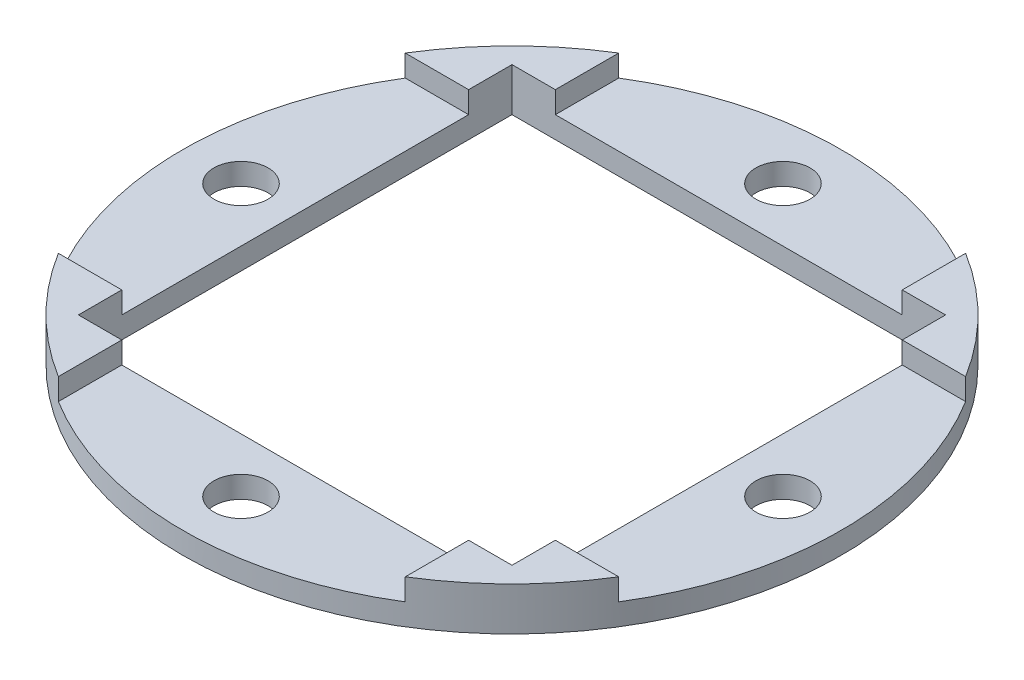
ISO-10303-21;
HEADER;
FILE_DESCRIPTION(('STEP AP214'),'2;1');
FILE_NAME('part.step','',(''),(''),'','','');
FILE_SCHEMA(('AUTOMOTIVE_DESIGN { 1 0 10303 214 1 1 1 1 }'));
ENDSEC;
DATA;
#1=APPLICATION_CONTEXT('core data for automotive mechanical design processes');
#2=APPLICATION_PROTOCOL_DEFINITION('international standard','automotive_design',2000,#1);
#3=PRODUCT_CONTEXT('',#1,'mechanical');
#4=PRODUCT('Part','Part','',(#3));
#5=PRODUCT_RELATED_PRODUCT_CATEGORY('part','',(#4));
#6=PRODUCT_DEFINITION_FORMATION('','',#4);
#7=PRODUCT_DEFINITION_CONTEXT('part definition',#1,'design');
#8=PRODUCT_DEFINITION('design','',#6,#7);
#9=PRODUCT_DEFINITION_SHAPE('','',#8);
#10=(LENGTH_UNIT() NAMED_UNIT(*) SI_UNIT(.MILLI.,.METRE.));
#11=(NAMED_UNIT(*) PLANE_ANGLE_UNIT() SI_UNIT($,.RADIAN.));
#12=(NAMED_UNIT(*) SI_UNIT($,.STERADIAN.) SOLID_ANGLE_UNIT());
#13=UNCERTAINTY_MEASURE_WITH_UNIT(LENGTH_MEASURE(1.E-05),#10,'distance_accuracy_value','');
#14=(GEOMETRIC_REPRESENTATION_CONTEXT(3) GLOBAL_UNCERTAINTY_ASSIGNED_CONTEXT((#13)) GLOBAL_UNIT_ASSIGNED_CONTEXT((#10,
#11,#12)) REPRESENTATION_CONTEXT('',''));
#15=CARTESIAN_POINT('',(0.,0.,0.));
#16=DIRECTION('',(0.,0.,1.));
#17=DIRECTION('',(1.,0.,0.));
#18=AXIS2_PLACEMENT_3D('',#15,#16,#17);
#19=CARTESIAN_POINT('',(0.,5.,0.));
#20=DIRECTION('',(0.,1.,0.));
#21=DIRECTION('',(0.,0.,1.));
#22=AXIS2_PLACEMENT_3D('',#19,#20,#21);
#23=PLANE('',#22);
#24=CARTESIAN_POINT('',(62.5,5.,0.));
#25=DIRECTION('',(0.,1.,0.));
#26=DIRECTION('',(0.,0.,1.));
#27=AXIS2_PLACEMENT_3D('',#24,#25,#26);
#28=CIRCLE('',#27,6.25);
#29=CARTESIAN_POINT('',(62.5,5.,6.25));
#30=VERTEX_POINT('',#29);
#31=EDGE_CURVE('E361',#30,#30,#28,.T.);
#32=ORIENTED_EDGE('',*,*,#31,.F.);
#33=EDGE_LOOP('',(#32));
#34=FACE_BOUND('',#33,.T.);
#35=CARTESIAN_POINT('',(0.,5.,0.));
#36=DIRECTION('',(0.,1.,0.));
#37=DIRECTION('',(0.,0.,1.));
#38=AXIS2_PLACEMENT_3D('',#35,#36,#37);
#39=CIRCLE('',#38,76.);
#40=CARTESIAN_POINT('',(64.6219776856141,5.,40.));
#41=VERTEX_POINT('',#40);
#42=CARTESIAN_POINT('',(64.6219776856141,5.,-40.));
#43=VERTEX_POINT('',#42);
#44=EDGE_CURVE('E12',#41,#43,#39,.T.);
#45=ORIENTED_EDGE('',*,*,#44,.T.);
#46=DIRECTION('',(1.,0.,0.));
#47=VECTOR('',#46,1.);
#48=CARTESIAN_POINT('',(0.,5.,-40.));
#49=LINE('',#48,#47);
#50=CARTESIAN_POINT('',(50.,5.,-40.));
#51=VERTEX_POINT('',#50);
#52=EDGE_CURVE('E517',#51,#43,#49,.T.);
#53=ORIENTED_EDGE('',*,*,#52,.F.);
#54=DIRECTION('',(0.,0.,-1.));
#55=VECTOR('',#54,1.);
#56=CARTESIAN_POINT('',(50.,5.,50.));
#57=LINE('',#56,#55);
#58=CARTESIAN_POINT('',(50.,5.,40.));
#59=VERTEX_POINT('',#58);
#60=EDGE_CURVE('E225',#59,#51,#57,.T.);
#61=ORIENTED_EDGE('',*,*,#60,.F.);
#62=DIRECTION('',(1.,0.,0.));
#63=VECTOR('',#62,1.);
#64=CARTESIAN_POINT('',(0.,5.,40.));
#65=LINE('',#64,#63);
#66=EDGE_CURVE('E317',#59,#41,#65,.T.);
#67=ORIENTED_EDGE('',*,*,#66,.T.);
#68=EDGE_LOOP('',(#45,#53,#61,#67));
#69=FACE_BOUND('',#68,.T.);
#70=ADVANCED_FACE('F56',(#34,#69),#23,.T.);
#71=DIRECTION('',(0.,0.,-1.));
#72=VECTOR('',#71,1.);
#73=CARTESIAN_POINT('',(40.,5.,0.));
#74=LINE('',#73,#72);
#75=CARTESIAN_POINT('',(40.,5.,-50.));
#76=VERTEX_POINT('',#75);
#77=CARTESIAN_POINT('',(40.,5.,-64.6219776856141));
#78=VERTEX_POINT('',#77);
#79=EDGE_CURVE('E219',#76,#78,#74,.T.);
#80=ORIENTED_EDGE('',*,*,#79,.T.);
#81=CARTESIAN_POINT('',(-40.,5.,-64.621977685614));
#82=VERTEX_POINT('',#81);
#83=EDGE_CURVE('E66',#78,#82,#39,.T.);
#84=ORIENTED_EDGE('',*,*,#83,.T.);
#85=DIRECTION('',(0.,0.,-1.));
#86=VECTOR('',#85,1.);
#87=CARTESIAN_POINT('',(-40.,5.,0.));
#88=LINE('',#87,#86);
#89=CARTESIAN_POINT('',(-40.,5.,-50.));
#90=VERTEX_POINT('',#89);
#91=EDGE_CURVE('E227',#90,#82,#88,.T.);
#92=ORIENTED_EDGE('',*,*,#91,.F.);
#93=DIRECTION('',(1.,0.,0.));
#94=VECTOR('',#93,1.);
#95=CARTESIAN_POINT('',(-50.,5.,-50.));
#96=LINE('',#95,#94);
#97=EDGE_CURVE('E368',#90,#76,#96,.T.);
#98=ORIENTED_EDGE('',*,*,#97,.T.);
#99=EDGE_LOOP('',(#80,#84,#92,#98));
#100=FACE_BOUND('',#99,.T.);
#101=CARTESIAN_POINT('',(0.,5.,-62.5));
#102=DIRECTION('',(0.,1.,0.));
#103=DIRECTION('',(0.,0.,1.));
#104=AXIS2_PLACEMENT_3D('',#101,#102,#103);
#105=CIRCLE('',#104,6.25);
#106=CARTESIAN_POINT('',(0.,5.,-56.25));
#107=VERTEX_POINT('',#106);
#108=EDGE_CURVE('E357',#107,#107,#105,.T.);
#109=ORIENTED_EDGE('',*,*,#108,.F.);
#110=EDGE_LOOP('',(#109));
#111=FACE_BOUND('',#110,.T.);
#112=ADVANCED_FACE('F445',(#100,#111),#23,.T.);
#113=DIRECTION('',(-1.,0.,0.));
#114=VECTOR('',#113,1.);
#115=CARTESIAN_POINT('',(0.,5.,-40.));
#116=LINE('',#115,#114);
#117=CARTESIAN_POINT('',(-50.,5.,-40.));
#118=VERTEX_POINT('',#117);
#119=CARTESIAN_POINT('',(-64.6219776856141,5.,-40.));
#120=VERTEX_POINT('',#119);
#121=EDGE_CURVE('E75',#118,#120,#116,.T.);
#122=ORIENTED_EDGE('',*,*,#121,.T.);
#123=CARTESIAN_POINT('',(-64.6219776856141,5.,40.));
#124=VERTEX_POINT('',#123);
#125=EDGE_CURVE('E532',#120,#124,#39,.T.);
#126=ORIENTED_EDGE('',*,*,#125,.T.);
#127=DIRECTION('',(-1.,0.,0.));
#128=VECTOR('',#127,1.);
#129=CARTESIAN_POINT('',(0.,5.,40.));
#130=LINE('',#129,#128);
#131=CARTESIAN_POINT('',(-50.,5.,40.));
#132=VERTEX_POINT('',#131);
#133=EDGE_CURVE('E278',#132,#124,#130,.T.);
#134=ORIENTED_EDGE('',*,*,#133,.F.);
#135=DIRECTION('',(0.,0.,-1.));
#136=VECTOR('',#135,1.);
#137=CARTESIAN_POINT('',(-50.,5.,50.));
#138=LINE('',#137,#136);
#139=EDGE_CURVE('E378',#132,#118,#138,.T.);
#140=ORIENTED_EDGE('',*,*,#139,.T.);
#141=EDGE_LOOP('',(#122,#126,#134,#140));
#142=FACE_BOUND('',#141,.T.);
#143=CARTESIAN_POINT('',(-62.5,5.,0.));
#144=DIRECTION('',(0.,1.,0.));
#145=DIRECTION('',(0.,0.,1.));
#146=AXIS2_PLACEMENT_3D('',#143,#144,#145);
#147=CIRCLE('',#146,6.25);
#148=CARTESIAN_POINT('',(-62.5,5.,6.25));
#149=VERTEX_POINT('',#148);
#150=EDGE_CURVE('E352',#149,#149,#147,.T.);
#151=ORIENTED_EDGE('',*,*,#150,.F.);
#152=EDGE_LOOP('',(#151));
#153=FACE_BOUND('',#152,.T.);
#154=ADVANCED_FACE('F452',(#142,#153),#23,.T.);
#155=DIRECTION('',(0.,0.,1.));
#156=VECTOR('',#155,1.);
#157=CARTESIAN_POINT('',(-40.,5.,0.));
#158=LINE('',#157,#156);
#159=CARTESIAN_POINT('',(-40.,5.,50.));
#160=VERTEX_POINT('',#159);
#161=CARTESIAN_POINT('',(-40.,5.,64.6219776856141));
#162=VERTEX_POINT('',#161);
#163=EDGE_CURVE('E272',#160,#162,#158,.T.);
#164=ORIENTED_EDGE('',*,*,#163,.T.);
#165=CARTESIAN_POINT('',(40.,5.,64.621977685614));
#166=VERTEX_POINT('',#165);
#167=EDGE_CURVE('E68',#162,#166,#39,.T.);
#168=ORIENTED_EDGE('',*,*,#167,.T.);
#169=DIRECTION('',(0.,0.,1.));
#170=VECTOR('',#169,1.);
#171=CARTESIAN_POINT('',(40.,5.,0.));
#172=LINE('',#171,#170);
#173=CARTESIAN_POINT('',(40.,5.,50.));
#174=VERTEX_POINT('',#173);
#175=EDGE_CURVE('E311',#174,#166,#172,.T.);
#176=ORIENTED_EDGE('',*,*,#175,.F.);
#177=DIRECTION('',(1.,0.,0.));
#178=VECTOR('',#177,1.);
#179=CARTESIAN_POINT('',(-50.,5.,50.));
#180=LINE('',#179,#178);
#181=EDGE_CURVE('E375',#160,#174,#180,.T.);
#182=ORIENTED_EDGE('',*,*,#181,.F.);
#183=EDGE_LOOP('',(#164,#168,#176,#182));
#184=FACE_BOUND('',#183,.T.);
#185=CARTESIAN_POINT('',(0.,5.,62.5));
#186=DIRECTION('',(0.,1.,0.));
#187=DIRECTION('',(0.,0.,1.));
#188=AXIS2_PLACEMENT_3D('',#185,#186,#187);
#189=CIRCLE('',#188,6.25);
#190=CARTESIAN_POINT('',(0.,5.,68.75));
#191=VERTEX_POINT('',#190);
#192=EDGE_CURVE('E351',#191,#191,#189,.T.);
#193=ORIENTED_EDGE('',*,*,#192,.F.);
#194=EDGE_LOOP('',(#193));
#195=FACE_BOUND('',#194,.T.);
#196=ADVANCED_FACE('F448',(#184,#195),#23,.T.);
#197=CARTESIAN_POINT('',(0.,5.,0.));
#198=DIRECTION('',(0.,-1.,0.));
#199=DIRECTION('',(0.,0.,-1.));
#200=AXIS2_PLACEMENT_3D('',#197,#198,#199);
#201=CYLINDRICAL_SURFACE('',#200,76.);
#202=ORIENTED_EDGE('',*,*,#44,.F.);
#203=DIRECTION('',(0.,-1.,0.));
#204=VECTOR('',#203,1.);
#205=CARTESIAN_POINT('',(64.6219776856141,10.,40.));
#206=LINE('',#205,#204);
#207=CARTESIAN_POINT('',(64.6219776856141,10.,40.));
#208=VERTEX_POINT('',#207);
#209=EDGE_CURVE('E339',#208,#41,#206,.T.);
#210=ORIENTED_EDGE('',*,*,#209,.F.);
#211=CARTESIAN_POINT('',(0.,10.,0.));
#212=DIRECTION('',(0.,1.,0.));
#213=DIRECTION('',(0.,0.,1.));
#214=AXIS2_PLACEMENT_3D('',#211,#212,#213);
#215=CIRCLE('',#214,76.);
#216=CARTESIAN_POINT('',(40.,10.,64.621977685614));
#217=VERTEX_POINT('',#216);
#218=EDGE_CURVE('E320',#217,#208,#215,.T.);
#219=ORIENTED_EDGE('',*,*,#218,.F.);
#220=DIRECTION('',(0.,-1.,0.));
#221=VECTOR('',#220,1.);
#222=CARTESIAN_POINT('',(40.,10.,64.621977685614));
#223=LINE('',#222,#221);
#224=EDGE_CURVE('E343',#217,#166,#223,.T.);
#225=ORIENTED_EDGE('',*,*,#224,.T.);
#226=ORIENTED_EDGE('',*,*,#167,.F.);
#227=DIRECTION('',(0.,-1.,0.));
#228=VECTOR('',#227,1.);
#229=CARTESIAN_POINT('',(-40.,10.,64.6219776856141));
#230=LINE('',#229,#228);
#231=CARTESIAN_POINT('',(-40.,10.,64.6219776856141));
#232=VERTEX_POINT('',#231);
#233=EDGE_CURVE('E291',#232,#162,#230,.T.);
#234=ORIENTED_EDGE('',*,*,#233,.F.);
#235=CARTESIAN_POINT('',(0.,10.,0.));
#236=DIRECTION('',(0.,1.,0.));
#237=DIRECTION('',(0.,0.,1.));
#238=AXIS2_PLACEMENT_3D('',#235,#236,#237);
#239=CIRCLE('',#238,76.);
#240=CARTESIAN_POINT('',(-64.6219776856141,10.,40.));
#241=VERTEX_POINT('',#240);
#242=EDGE_CURVE('E288',#241,#232,#239,.T.);
#243=ORIENTED_EDGE('',*,*,#242,.F.);
#244=DIRECTION('',(0.,-1.,0.));
#245=VECTOR('',#244,1.);
#246=CARTESIAN_POINT('',(-64.6219776856141,10.,40.));
#247=LINE('',#246,#245);
#248=EDGE_CURVE('E300',#241,#124,#247,.T.);
#249=ORIENTED_EDGE('',*,*,#248,.T.);
#250=ORIENTED_EDGE('',*,*,#125,.F.);
#251=DIRECTION('',(0.,-1.,0.));
#252=VECTOR('',#251,1.);
#253=CARTESIAN_POINT('',(-64.6219776856141,10.,-40.));
#254=LINE('',#253,#252);
#255=CARTESIAN_POINT('',(-64.6219776856141,10.,-40.));
#256=VERTEX_POINT('',#255);
#257=EDGE_CURVE('E260',#256,#120,#254,.T.);
#258=ORIENTED_EDGE('',*,*,#257,.F.);
#259=CARTESIAN_POINT('',(0.,10.,0.));
#260=DIRECTION('',(0.,1.,0.));
#261=DIRECTION('',(0.,0.,1.));
#262=AXIS2_PLACEMENT_3D('',#259,#260,#261);
#263=CIRCLE('',#262,76.);
#264=CARTESIAN_POINT('',(-40.,10.,-64.621977685614));
#265=VERTEX_POINT('',#264);
#266=EDGE_CURVE('E243',#265,#256,#263,.T.);
#267=ORIENTED_EDGE('',*,*,#266,.F.);
#268=DIRECTION('',(0.,-1.,0.));
#269=VECTOR('',#268,1.);
#270=CARTESIAN_POINT('',(-40.,10.,-64.621977685614));
#271=LINE('',#270,#269);
#272=EDGE_CURVE('E264',#265,#82,#271,.T.);
#273=ORIENTED_EDGE('',*,*,#272,.T.);
#274=ORIENTED_EDGE('',*,*,#83,.F.);
#275=DIRECTION('',(0.,-1.,0.));
#276=VECTOR('',#275,1.);
#277=CARTESIAN_POINT('',(40.,10.,-64.6219776856141));
#278=LINE('',#277,#276);
#279=CARTESIAN_POINT('',(40.,10.,-64.6219776856141));
#280=VERTEX_POINT('',#279);
#281=EDGE_CURVE('E232',#280,#78,#278,.T.);
#282=ORIENTED_EDGE('',*,*,#281,.F.);
#283=CARTESIAN_POINT('',(0.,10.,0.));
#284=DIRECTION('',(0.,1.,0.));
#285=DIRECTION('',(0.,0.,1.));
#286=AXIS2_PLACEMENT_3D('',#283,#284,#285);
#287=CIRCLE('',#286,76.);
#288=CARTESIAN_POINT('',(64.6219776856141,10.,-40.));
#289=VERTEX_POINT('',#288);
#290=EDGE_CURVE('E207',#289,#280,#287,.T.);
#291=ORIENTED_EDGE('',*,*,#290,.F.);
#292=DIRECTION('',(0.,-1.,0.));
#293=VECTOR('',#292,1.);
#294=CARTESIAN_POINT('',(64.6219776856141,10.,-40.));
#295=LINE('',#294,#293);
#296=EDGE_CURVE('E203',#289,#43,#295,.T.);
#297=ORIENTED_EDGE('',*,*,#296,.T.);
#298=EDGE_LOOP('',(#202,#210,#219,#225,#226,#234,#243,#249,#250,#258,#267,#273,#274,#282,#291,#297));
#299=FACE_BOUND('',#298,.T.);
#300=CARTESIAN_POINT('',(0.,0.,0.));
#301=DIRECTION('',(0.,1.,0.));
#302=DIRECTION('',(0.,0.,1.));
#303=AXIS2_PLACEMENT_3D('',#300,#301,#302);
#304=CIRCLE('',#303,76.);
#305=CARTESIAN_POINT('',(0.,0.,76.));
#306=VERTEX_POINT('',#305);
#307=EDGE_CURVE('E399',#306,#306,#304,.T.);
#308=ORIENTED_EDGE('',*,*,#307,.T.);
#309=EDGE_LOOP('',(#308));
#310=FACE_BOUND('',#309,.T.);
#311=ADVANCED_FACE('F58',(#299,#310),#201,.T.);
#312=CARTESIAN_POINT('',(0.,0.,0.));
#313=DIRECTION('',(0.,1.,0.));
#314=DIRECTION('',(0.,0.,1.));
#315=AXIS2_PLACEMENT_3D('',#312,#313,#314);
#316=PLANE('',#315);
#317=CARTESIAN_POINT('',(-62.5,0.,0.));
#318=DIRECTION('',(0.,1.,0.));
#319=DIRECTION('',(0.,0.,1.));
#320=AXIS2_PLACEMENT_3D('',#317,#318,#319);
#321=CIRCLE('',#320,6.25);
#322=CARTESIAN_POINT('',(-62.5,0.,6.25));
#323=VERTEX_POINT('',#322);
#324=EDGE_CURVE('E60',#323,#323,#321,.T.);
#325=ORIENTED_EDGE('',*,*,#324,.T.);
#326=EDGE_LOOP('',(#325));
#327=FACE_BOUND('',#326,.T.);
#328=CARTESIAN_POINT('',(0.,0.,-62.5));
#329=DIRECTION('',(0.,1.,0.));
#330=DIRECTION('',(0.,0.,1.));
#331=AXIS2_PLACEMENT_3D('',#328,#329,#330);
#332=CIRCLE('',#331,6.25);
#333=CARTESIAN_POINT('',(0.,0.,-56.25));
#334=VERTEX_POINT('',#333);
#335=EDGE_CURVE('E417',#334,#334,#332,.T.);
#336=ORIENTED_EDGE('',*,*,#335,.T.);
#337=EDGE_LOOP('',(#336));
#338=FACE_BOUND('',#337,.T.);
#339=CARTESIAN_POINT('',(62.5,0.,0.));
#340=DIRECTION('',(0.,1.,0.));
#341=DIRECTION('',(0.,0.,1.));
#342=AXIS2_PLACEMENT_3D('',#339,#340,#341);
#343=CIRCLE('',#342,6.25);
#344=CARTESIAN_POINT('',(62.5,0.,6.25));
#345=VERTEX_POINT('',#344);
#346=EDGE_CURVE('E414',#345,#345,#343,.T.);
#347=ORIENTED_EDGE('',*,*,#346,.T.);
#348=EDGE_LOOP('',(#347));
#349=FACE_BOUND('',#348,.T.);
#350=CARTESIAN_POINT('',(0.,0.,62.5));
#351=DIRECTION('',(0.,1.,0.));
#352=DIRECTION('',(0.,0.,1.));
#353=AXIS2_PLACEMENT_3D('',#350,#351,#352);
#354=CIRCLE('',#353,6.25);
#355=CARTESIAN_POINT('',(0.,0.,68.75));
#356=VERTEX_POINT('',#355);
#357=EDGE_CURVE('E356',#356,#356,#354,.T.);
#358=ORIENTED_EDGE('',*,*,#357,.T.);
#359=EDGE_LOOP('',(#358));
#360=FACE_BOUND('',#359,.T.);
#361=DIRECTION('',(0.,0.,-1.));
#362=VECTOR('',#361,1.);
#363=CARTESIAN_POINT('',(50.,0.,50.));
#364=LINE('',#363,#362);
#365=CARTESIAN_POINT('',(50.,0.,50.));
#366=VERTEX_POINT('',#365);
#367=CARTESIAN_POINT('',(50.,0.,-50.));
#368=VERTEX_POINT('',#367);
#369=EDGE_CURVE('E385',#366,#368,#364,.T.);
#370=ORIENTED_EDGE('',*,*,#369,.T.);
#371=DIRECTION('',(1.,0.,0.));
#372=VECTOR('',#371,1.);
#373=CARTESIAN_POINT('',(-50.,0.,-50.));
#374=LINE('',#373,#372);
#375=CARTESIAN_POINT('',(-50.,0.,-50.));
#376=VERTEX_POINT('',#375);
#377=EDGE_CURVE('E382',#376,#368,#374,.T.);
#378=ORIENTED_EDGE('',*,*,#377,.F.);
#379=DIRECTION('',(0.,0.,-1.));
#380=VECTOR('',#379,1.);
#381=CARTESIAN_POINT('',(-50.,0.,50.));
#382=LINE('',#381,#380);
#383=CARTESIAN_POINT('',(-50.,0.,50.));
#384=VERTEX_POINT('',#383);
#385=EDGE_CURVE('E372',#384,#376,#382,.T.);
#386=ORIENTED_EDGE('',*,*,#385,.F.);
#387=DIRECTION('',(1.,0.,0.));
#388=VECTOR('',#387,1.);
#389=CARTESIAN_POINT('',(-50.,0.,50.));
#390=LINE('',#389,#388);
#391=EDGE_CURVE('E389',#384,#366,#390,.T.);
#392=ORIENTED_EDGE('',*,*,#391,.T.);
#393=EDGE_LOOP('',(#370,#378,#386,#392));
#394=FACE_BOUND('',#393,.T.);
#395=ORIENTED_EDGE('',*,*,#307,.F.);
#396=EDGE_LOOP('',(#395));
#397=FACE_BOUND('',#396,.T.);
#398=ADVANCED_FACE('F426',(#327,#338,#349,#360,#394,#397),#316,.F.);
#399=CARTESIAN_POINT('',(-50.,5.,-50.));
#400=DIRECTION('',(0.,0.,-1.));
#401=DIRECTION('',(-1.,0.,0.));
#402=AXIS2_PLACEMENT_3D('',#399,#400,#401);
#403=PLANE('',#402);
#404=ORIENTED_EDGE('',*,*,#377,.T.);
#405=DIRECTION('',(0.,-1.,0.));
#406=VECTOR('',#405,1.);
#407=CARTESIAN_POINT('',(50.,5.,-50.));
#408=LINE('',#407,#406);
#409=CARTESIAN_POINT('',(50.,10.,-50.));
#410=VERTEX_POINT('',#409);
#411=EDGE_CURVE('E381',#410,#368,#408,.T.);
#412=ORIENTED_EDGE('',*,*,#411,.F.);
#413=DIRECTION('',(1.,0.,0.));
#414=VECTOR('',#413,1.);
#415=CARTESIAN_POINT('',(0.,10.,-50.));
#416=LINE('',#415,#414);
#417=CARTESIAN_POINT('',(40.,10.,-50.));
#418=VERTEX_POINT('',#417);
#419=EDGE_CURVE('E215',#418,#410,#416,.T.);
#420=ORIENTED_EDGE('',*,*,#419,.F.);
#421=DIRECTION('',(0.,-1.,0.));
#422=VECTOR('',#421,1.);
#423=CARTESIAN_POINT('',(40.,10.,-50.));
#424=LINE('',#423,#422);
#425=EDGE_CURVE('E516',#418,#76,#424,.T.);
#426=ORIENTED_EDGE('',*,*,#425,.T.);
#427=ORIENTED_EDGE('',*,*,#97,.F.);
#428=DIRECTION('',(0.,-1.,0.));
#429=VECTOR('',#428,1.);
#430=CARTESIAN_POINT('',(-40.,10.,-50.));
#431=LINE('',#430,#429);
#432=CARTESIAN_POINT('',(-40.,10.,-50.));
#433=VERTEX_POINT('',#432);
#434=EDGE_CURVE('E268',#433,#90,#431,.T.);
#435=ORIENTED_EDGE('',*,*,#434,.F.);
#436=DIRECTION('',(1.,0.,0.));
#437=VECTOR('',#436,1.);
#438=CARTESIAN_POINT('',(0.,10.,-50.));
#439=LINE('',#438,#437);
#440=CARTESIAN_POINT('',(-50.,10.,-50.));
#441=VERTEX_POINT('',#440);
#442=EDGE_CURVE('E236',#441,#433,#439,.T.);
#443=ORIENTED_EDGE('',*,*,#442,.F.);
#444=DIRECTION('',(0.,-1.,0.));
#445=VECTOR('',#444,1.);
#446=CARTESIAN_POINT('',(-50.,5.,-50.));
#447=LINE('',#446,#445);
#448=EDGE_CURVE('E396',#441,#376,#447,.T.);
#449=ORIENTED_EDGE('',*,*,#448,.T.);
#450=EDGE_LOOP('',(#404,#412,#420,#426,#427,#435,#443,#449));
#451=FACE_BOUND('',#450,.T.);
#452=ADVANCED_FACE('F476',(#451),#403,.F.);
#453=CARTESIAN_POINT('',(-50.,5.,50.));
#454=DIRECTION('',(-1.,0.,0.));
#455=DIRECTION('',(0.,0.,1.));
#456=AXIS2_PLACEMENT_3D('',#453,#454,#455);
#457=PLANE('',#456);
#458=ORIENTED_EDGE('',*,*,#385,.T.);
#459=ORIENTED_EDGE('',*,*,#448,.F.);
#460=DIRECTION('',(0.,0.,-1.));
#461=VECTOR('',#460,1.);
#462=CARTESIAN_POINT('',(-50.,10.,0.));
#463=LINE('',#462,#461);
#464=CARTESIAN_POINT('',(-50.,10.,-40.));
#465=VERTEX_POINT('',#464);
#466=EDGE_CURVE('E250',#465,#441,#463,.T.);
#467=ORIENTED_EDGE('',*,*,#466,.F.);
#468=DIRECTION('',(0.,-1.,0.));
#469=VECTOR('',#468,1.);
#470=CARTESIAN_POINT('',(-50.,10.,-40.));
#471=LINE('',#470,#469);
#472=EDGE_CURVE('E253',#465,#118,#471,.T.);
#473=ORIENTED_EDGE('',*,*,#472,.T.);
#474=ORIENTED_EDGE('',*,*,#139,.F.);
#475=DIRECTION('',(0.,-1.,0.));
#476=VECTOR('',#475,1.);
#477=CARTESIAN_POINT('',(-50.,10.,40.));
#478=LINE('',#477,#476);
#479=CARTESIAN_POINT('',(-50.,10.,40.));
#480=VERTEX_POINT('',#479);
#481=EDGE_CURVE('E304',#480,#132,#478,.T.);
#482=ORIENTED_EDGE('',*,*,#481,.F.);
#483=DIRECTION('',(0.,0.,-1.));
#484=VECTOR('',#483,1.);
#485=CARTESIAN_POINT('',(-50.,10.,0.));
#486=LINE('',#485,#484);
#487=CARTESIAN_POINT('',(-50.,10.,50.));
#488=VERTEX_POINT('',#487);
#489=EDGE_CURVE('E282',#488,#480,#486,.T.);
#490=ORIENTED_EDGE('',*,*,#489,.F.);
#491=DIRECTION('',(0.,-1.,0.));
#492=VECTOR('',#491,1.);
#493=CARTESIAN_POINT('',(-50.,5.,50.));
#494=LINE('',#493,#492);
#495=EDGE_CURVE('E400',#488,#384,#494,.T.);
#496=ORIENTED_EDGE('',*,*,#495,.T.);
#497=EDGE_LOOP('',(#458,#459,#467,#473,#474,#482,#490,#496));
#498=FACE_BOUND('',#497,.T.);
#499=ADVANCED_FACE('F489',(#498),#457,.F.);
#500=CARTESIAN_POINT('',(-50.,5.,50.));
#501=DIRECTION('',(0.,0.,-1.));
#502=DIRECTION('',(-1.,0.,0.));
#503=AXIS2_PLACEMENT_3D('',#500,#501,#502);
#504=PLANE('',#503);
#505=ORIENTED_EDGE('',*,*,#391,.F.);
#506=ORIENTED_EDGE('',*,*,#495,.F.);
#507=DIRECTION('',(-1.,0.,0.));
#508=VECTOR('',#507,1.);
#509=CARTESIAN_POINT('',(0.,10.,50.));
#510=LINE('',#509,#508);
#511=CARTESIAN_POINT('',(-40.,10.,50.));
#512=VERTEX_POINT('',#511);
#513=EDGE_CURVE('E277',#512,#488,#510,.T.);
#514=ORIENTED_EDGE('',*,*,#513,.F.);
#515=DIRECTION('',(0.,-1.,0.));
#516=VECTOR('',#515,1.);
#517=CARTESIAN_POINT('',(-40.,10.,50.));
#518=LINE('',#517,#516);
#519=EDGE_CURVE('E307',#512,#160,#518,.T.);
#520=ORIENTED_EDGE('',*,*,#519,.T.);
#521=ORIENTED_EDGE('',*,*,#181,.T.);
#522=DIRECTION('',(0.,-1.,0.));
#523=VECTOR('',#522,1.);
#524=CARTESIAN_POINT('',(40.,10.,50.));
#525=LINE('',#524,#523);
#526=CARTESIAN_POINT('',(40.,10.,50.));
#527=VERTEX_POINT('',#526);
#528=EDGE_CURVE('E347',#527,#174,#525,.T.);
#529=ORIENTED_EDGE('',*,*,#528,.F.);
#530=DIRECTION('',(-1.,0.,0.));
#531=VECTOR('',#530,1.);
#532=CARTESIAN_POINT('',(0.,10.,50.));
#533=LINE('',#532,#531);
#534=CARTESIAN_POINT('',(50.,10.,50.));
#535=VERTEX_POINT('',#534);
#536=EDGE_CURVE('E312',#535,#527,#533,.T.);
#537=ORIENTED_EDGE('',*,*,#536,.F.);
#538=DIRECTION('',(0.,-1.,0.));
#539=VECTOR('',#538,1.);
#540=CARTESIAN_POINT('',(50.,5.,50.));
#541=LINE('',#540,#539);
#542=EDGE_CURVE('E403',#535,#366,#541,.T.);
#543=ORIENTED_EDGE('',*,*,#542,.T.);
#544=EDGE_LOOP('',(#505,#506,#514,#520,#521,#529,#537,#543));
#545=FACE_BOUND('',#544,.T.);
#546=ADVANCED_FACE('F494',(#545),#504,.T.);
#547=CARTESIAN_POINT('',(50.,5.,50.));
#548=DIRECTION('',(-1.,0.,0.));
#549=DIRECTION('',(0.,0.,1.));
#550=AXIS2_PLACEMENT_3D('',#547,#548,#549);
#551=PLANE('',#550);
#552=ORIENTED_EDGE('',*,*,#369,.F.);
#553=ORIENTED_EDGE('',*,*,#542,.F.);
#554=DIRECTION('',(0.,0.,1.));
#555=VECTOR('',#554,1.);
#556=CARTESIAN_POINT('',(50.,10.,0.));
#557=LINE('',#556,#555);
#558=CARTESIAN_POINT('',(50.,10.,40.));
#559=VERTEX_POINT('',#558);
#560=EDGE_CURVE('E327',#559,#535,#557,.T.);
#561=ORIENTED_EDGE('',*,*,#560,.F.);
#562=DIRECTION('',(0.,-1.,0.));
#563=VECTOR('',#562,1.);
#564=CARTESIAN_POINT('',(50.,10.,40.));
#565=LINE('',#564,#563);
#566=EDGE_CURVE('E331',#559,#59,#565,.T.);
#567=ORIENTED_EDGE('',*,*,#566,.T.);
#568=ORIENTED_EDGE('',*,*,#60,.T.);
#569=DIRECTION('',(0.,-1.,0.));
#570=VECTOR('',#569,1.);
#571=CARTESIAN_POINT('',(50.,10.,-40.));
#572=LINE('',#571,#570);
#573=CARTESIAN_POINT('',(50.,10.,-40.));
#574=VERTEX_POINT('',#573);
#575=EDGE_CURVE('E200',#574,#51,#572,.T.);
#576=ORIENTED_EDGE('',*,*,#575,.F.);
#577=DIRECTION('',(0.,0.,1.));
#578=VECTOR('',#577,1.);
#579=CARTESIAN_POINT('',(50.,10.,0.));
#580=LINE('',#579,#578);
#581=EDGE_CURVE('E208',#410,#574,#580,.T.);
#582=ORIENTED_EDGE('',*,*,#581,.F.);
#583=ORIENTED_EDGE('',*,*,#411,.T.);
#584=EDGE_LOOP('',(#552,#553,#561,#567,#568,#576,#582,#583));
#585=FACE_BOUND('',#584,.T.);
#586=ADVANCED_FACE('F223',(#585),#551,.T.);
#587=CARTESIAN_POINT('',(0.,-5.,62.5));
#588=DIRECTION('',(0.,1.,0.));
#589=DIRECTION('',(0.,0.,1.));
#590=AXIS2_PLACEMENT_3D('',#587,#588,#589);
#591=CYLINDRICAL_SURFACE('',#590,6.25);
#592=ORIENTED_EDGE('',*,*,#192,.T.);
#593=EDGE_LOOP('',(#592));
#594=FACE_BOUND('',#593,.T.);
#595=ORIENTED_EDGE('',*,*,#357,.F.);
#596=EDGE_LOOP('',(#595));
#597=FACE_BOUND('',#596,.T.);
#598=ADVANCED_FACE('F468',(#594,#597),#591,.F.);
#599=CARTESIAN_POINT('',(62.5,-5.,0.));
#600=DIRECTION('',(0.,1.,0.));
#601=DIRECTION('',(0.,0.,1.));
#602=AXIS2_PLACEMENT_3D('',#599,#600,#601);
#603=CYLINDRICAL_SURFACE('',#602,6.25);
#604=ORIENTED_EDGE('',*,*,#31,.T.);
#605=EDGE_LOOP('',(#604));
#606=FACE_BOUND('',#605,.T.);
#607=ORIENTED_EDGE('',*,*,#346,.F.);
#608=EDGE_LOOP('',(#607));
#609=FACE_BOUND('',#608,.T.);
#610=ADVANCED_FACE('F441',(#606,#609),#603,.F.);
#611=CARTESIAN_POINT('',(0.,-5.,-62.5));
#612=DIRECTION('',(0.,1.,0.));
#613=DIRECTION('',(0.,0.,1.));
#614=AXIS2_PLACEMENT_3D('',#611,#612,#613);
#615=CYLINDRICAL_SURFACE('',#614,6.25);
#616=ORIENTED_EDGE('',*,*,#108,.T.);
#617=EDGE_LOOP('',(#616));
#618=FACE_BOUND('',#617,.T.);
#619=ORIENTED_EDGE('',*,*,#335,.F.);
#620=EDGE_LOOP('',(#619));
#621=FACE_BOUND('',#620,.T.);
#622=ADVANCED_FACE('F431',(#618,#621),#615,.F.);
#623=CARTESIAN_POINT('',(-62.5,-5.,0.));
#624=DIRECTION('',(0.,1.,0.));
#625=DIRECTION('',(0.,0.,1.));
#626=AXIS2_PLACEMENT_3D('',#623,#624,#625);
#627=CYLINDRICAL_SURFACE('',#626,6.25);
#628=ORIENTED_EDGE('',*,*,#150,.T.);
#629=EDGE_LOOP('',(#628));
#630=FACE_BOUND('',#629,.T.);
#631=ORIENTED_EDGE('',*,*,#324,.F.);
#632=EDGE_LOOP('',(#631));
#633=FACE_BOUND('',#632,.T.);
#634=ADVANCED_FACE('F428',(#630,#633),#627,.F.);
#635=CARTESIAN_POINT('',(40.,10.,0.));
#636=DIRECTION('',(1.,0.,0.));
#637=DIRECTION('',(0.,0.,-1.));
#638=AXIS2_PLACEMENT_3D('',#635,#636,#637);
#639=PLANE('',#638);
#640=ORIENTED_EDGE('',*,*,#175,.T.);
#641=ORIENTED_EDGE('',*,*,#224,.F.);
#642=DIRECTION('',(0.,0.,1.));
#643=VECTOR('',#642,1.);
#644=CARTESIAN_POINT('',(40.,10.,0.));
#645=LINE('',#644,#643);
#646=EDGE_CURVE('E316',#527,#217,#645,.T.);
#647=ORIENTED_EDGE('',*,*,#646,.F.);
#648=ORIENTED_EDGE('',*,*,#528,.T.);
#649=EDGE_LOOP('',(#640,#641,#647,#648));
#650=FACE_BOUND('',#649,.T.);
#651=ADVANCED_FACE('F430',(#650),#639,.F.);
#652=CARTESIAN_POINT('',(0.,10.,40.));
#653=DIRECTION('',(0.,0.,-1.));
#654=DIRECTION('',(-1.,0.,0.));
#655=AXIS2_PLACEMENT_3D('',#652,#653,#654);
#656=PLANE('',#655);
#657=ORIENTED_EDGE('',*,*,#66,.F.);
#658=ORIENTED_EDGE('',*,*,#566,.F.);
#659=DIRECTION('',(1.,0.,0.));
#660=VECTOR('',#659,1.);
#661=CARTESIAN_POINT('',(0.,10.,40.));
#662=LINE('',#661,#660);
#663=EDGE_CURVE('E323',#559,#208,#662,.T.);
#664=ORIENTED_EDGE('',*,*,#663,.T.);
#665=ORIENTED_EDGE('',*,*,#209,.T.);
#666=EDGE_LOOP('',(#657,#658,#664,#665));
#667=FACE_BOUND('',#666,.T.);
#668=ADVANCED_FACE('F438',(#667),#656,.T.);
#669=CARTESIAN_POINT('',(0.,10.,0.));
#670=DIRECTION('',(0.,1.,0.));
#671=DIRECTION('',(0.,0.,1.));
#672=AXIS2_PLACEMENT_3D('',#669,#670,#671);
#673=PLANE('',#672);
#674=ORIENTED_EDGE('',*,*,#536,.T.);
#675=ORIENTED_EDGE('',*,*,#646,.T.);
#676=ORIENTED_EDGE('',*,*,#218,.T.);
#677=ORIENTED_EDGE('',*,*,#663,.F.);
#678=ORIENTED_EDGE('',*,*,#560,.T.);
#679=EDGE_LOOP('',(#674,#675,#676,#677,#678));
#680=FACE_BOUND('',#679,.T.);
#681=ADVANCED_FACE('F498',(#680),#673,.T.);
#682=CARTESIAN_POINT('',(-40.,10.,0.));
#683=DIRECTION('',(1.,0.,0.));
#684=DIRECTION('',(0.,0.,-1.));
#685=AXIS2_PLACEMENT_3D('',#682,#683,#684);
#686=PLANE('',#685);
#687=ORIENTED_EDGE('',*,*,#163,.F.);
#688=ORIENTED_EDGE('',*,*,#519,.F.);
#689=DIRECTION('',(0.,0.,1.));
#690=VECTOR('',#689,1.);
#691=CARTESIAN_POINT('',(-40.,10.,0.));
#692=LINE('',#691,#690);
#693=EDGE_CURVE('E273',#512,#232,#692,.T.);
#694=ORIENTED_EDGE('',*,*,#693,.T.);
#695=ORIENTED_EDGE('',*,*,#233,.T.);
#696=EDGE_LOOP('',(#687,#688,#694,#695));
#697=FACE_BOUND('',#696,.T.);
#698=ADVANCED_FACE('F541',(#697),#686,.T.);
#699=CARTESIAN_POINT('',(0.,10.,40.));
#700=DIRECTION('',(0.,0.,1.));
#701=DIRECTION('',(1.,0.,0.));
#702=AXIS2_PLACEMENT_3D('',#699,#700,#701);
#703=PLANE('',#702);
#704=ORIENTED_EDGE('',*,*,#133,.T.);
#705=ORIENTED_EDGE('',*,*,#248,.F.);
#706=DIRECTION('',(-1.,0.,0.));
#707=VECTOR('',#706,1.);
#708=CARTESIAN_POINT('',(0.,10.,40.));
#709=LINE('',#708,#707);
#710=EDGE_CURVE('E285',#480,#241,#709,.T.);
#711=ORIENTED_EDGE('',*,*,#710,.F.);
#712=ORIENTED_EDGE('',*,*,#481,.T.);
#713=EDGE_LOOP('',(#704,#705,#711,#712));
#714=FACE_BOUND('',#713,.T.);
#715=ADVANCED_FACE('F547',(#714),#703,.F.);
#716=CARTESIAN_POINT('',(0.,10.,0.));
#717=DIRECTION('',(0.,1.,0.));
#718=DIRECTION('',(0.,0.,1.));
#719=AXIS2_PLACEMENT_3D('',#716,#717,#718);
#720=PLANE('',#719);
#721=ORIENTED_EDGE('',*,*,#693,.F.);
#722=ORIENTED_EDGE('',*,*,#513,.T.);
#723=ORIENTED_EDGE('',*,*,#489,.T.);
#724=ORIENTED_EDGE('',*,*,#710,.T.);
#725=ORIENTED_EDGE('',*,*,#242,.T.);
#726=EDGE_LOOP('',(#721,#722,#723,#724,#725));
#727=FACE_BOUND('',#726,.T.);
#728=ADVANCED_FACE('F543',(#727),#720,.T.);
#729=CARTESIAN_POINT('',(-40.,10.,0.));
#730=DIRECTION('',(-1.,0.,0.));
#731=DIRECTION('',(0.,0.,1.));
#732=AXIS2_PLACEMENT_3D('',#729,#730,#731);
#733=PLANE('',#732);
#734=ORIENTED_EDGE('',*,*,#91,.T.);
#735=ORIENTED_EDGE('',*,*,#272,.F.);
#736=DIRECTION('',(0.,0.,-1.));
#737=VECTOR('',#736,1.);
#738=CARTESIAN_POINT('',(-40.,10.,0.));
#739=LINE('',#738,#737);
#740=EDGE_CURVE('E240',#433,#265,#739,.T.);
#741=ORIENTED_EDGE('',*,*,#740,.F.);
#742=ORIENTED_EDGE('',*,*,#434,.T.);
#743=EDGE_LOOP('',(#734,#735,#741,#742));
#744=FACE_BOUND('',#743,.T.);
#745=ADVANCED_FACE('F555',(#744),#733,.F.);
#746=CARTESIAN_POINT('',(0.,10.,-40.));
#747=DIRECTION('',(0.,0.,1.));
#748=DIRECTION('',(1.,0.,0.));
#749=AXIS2_PLACEMENT_3D('',#746,#747,#748);
#750=PLANE('',#749);
#751=ORIENTED_EDGE('',*,*,#121,.F.);
#752=ORIENTED_EDGE('',*,*,#472,.F.);
#753=DIRECTION('',(-1.,0.,0.));
#754=VECTOR('',#753,1.);
#755=CARTESIAN_POINT('',(0.,10.,-40.));
#756=LINE('',#755,#754);
#757=EDGE_CURVE('E246',#465,#256,#756,.T.);
#758=ORIENTED_EDGE('',*,*,#757,.T.);
#759=ORIENTED_EDGE('',*,*,#257,.T.);
#760=EDGE_LOOP('',(#751,#752,#758,#759));
#761=FACE_BOUND('',#760,.T.);
#762=ADVANCED_FACE('F550',(#761),#750,.T.);
#763=CARTESIAN_POINT('',(0.,10.,0.));
#764=DIRECTION('',(0.,1.,0.));
#765=DIRECTION('',(0.,0.,1.));
#766=AXIS2_PLACEMENT_3D('',#763,#764,#765);
#767=PLANE('',#766);
#768=ORIENTED_EDGE('',*,*,#442,.T.);
#769=ORIENTED_EDGE('',*,*,#740,.T.);
#770=ORIENTED_EDGE('',*,*,#266,.T.);
#771=ORIENTED_EDGE('',*,*,#757,.F.);
#772=ORIENTED_EDGE('',*,*,#466,.T.);
#773=EDGE_LOOP('',(#768,#769,#770,#771,#772));
#774=FACE_BOUND('',#773,.T.);
#775=ADVANCED_FACE('F553',(#774),#767,.T.);
#776=CARTESIAN_POINT('',(0.,10.,-40.));
#777=DIRECTION('',(0.,0.,-1.));
#778=DIRECTION('',(-1.,0.,0.));
#779=AXIS2_PLACEMENT_3D('',#776,#777,#778);
#780=PLANE('',#779);
#781=ORIENTED_EDGE('',*,*,#52,.T.);
#782=ORIENTED_EDGE('',*,*,#296,.F.);
#783=DIRECTION('',(1.,0.,0.));
#784=VECTOR('',#783,1.);
#785=CARTESIAN_POINT('',(0.,10.,-40.));
#786=LINE('',#785,#784);
#787=EDGE_CURVE('E196',#574,#289,#786,.T.);
#788=ORIENTED_EDGE('',*,*,#787,.F.);
#789=ORIENTED_EDGE('',*,*,#575,.T.);
#790=EDGE_LOOP('',(#781,#782,#788,#789));
#791=FACE_BOUND('',#790,.T.);
#792=ADVANCED_FACE('F198',(#791),#780,.F.);
#793=CARTESIAN_POINT('',(40.,10.,0.));
#794=DIRECTION('',(-1.,0.,0.));
#795=DIRECTION('',(0.,0.,1.));
#796=AXIS2_PLACEMENT_3D('',#793,#794,#795);
#797=PLANE('',#796);
#798=ORIENTED_EDGE('',*,*,#79,.F.);
#799=ORIENTED_EDGE('',*,*,#425,.F.);
#800=DIRECTION('',(0.,0.,-1.));
#801=VECTOR('',#800,1.);
#802=CARTESIAN_POINT('',(40.,10.,0.));
#803=LINE('',#802,#801);
#804=EDGE_CURVE('E509',#418,#280,#803,.T.);
#805=ORIENTED_EDGE('',*,*,#804,.T.);
#806=ORIENTED_EDGE('',*,*,#281,.T.);
#807=EDGE_LOOP('',(#798,#799,#805,#806));
#808=FACE_BOUND('',#807,.T.);
#809=ADVANCED_FACE('F526',(#808),#797,.T.);
#810=CARTESIAN_POINT('',(0.,10.,0.));
#811=DIRECTION('',(0.,1.,0.));
#812=DIRECTION('',(0.,0.,1.));
#813=AXIS2_PLACEMENT_3D('',#810,#811,#812);
#814=PLANE('',#813);
#815=ORIENTED_EDGE('',*,*,#581,.T.);
#816=ORIENTED_EDGE('',*,*,#787,.T.);
#817=ORIENTED_EDGE('',*,*,#290,.T.);
#818=ORIENTED_EDGE('',*,*,#804,.F.);
#819=ORIENTED_EDGE('',*,*,#419,.T.);
#820=EDGE_LOOP('',(#815,#816,#817,#818,#819));
#821=FACE_BOUND('',#820,.T.);
#822=ADVANCED_FACE('F212',(#821),#814,.T.);
#823=CLOSED_SHELL('',(#70,#112,#154,#196,#311,#398,#452,#499,#546,#586,#598,#610,#622,#634,#651,
#668,#681,#698,#715,#728,#745,#762,#775,#792,#809,#822));
#824=MANIFOLD_SOLID_BREP('B2',#823);
#825=ADVANCED_BREP_SHAPE_REPRESENTATION('',(#18,#824),#14);
#826=SHAPE_DEFINITION_REPRESENTATION(#9,#825);
ENDSEC;
END-ISO-10303-21;
